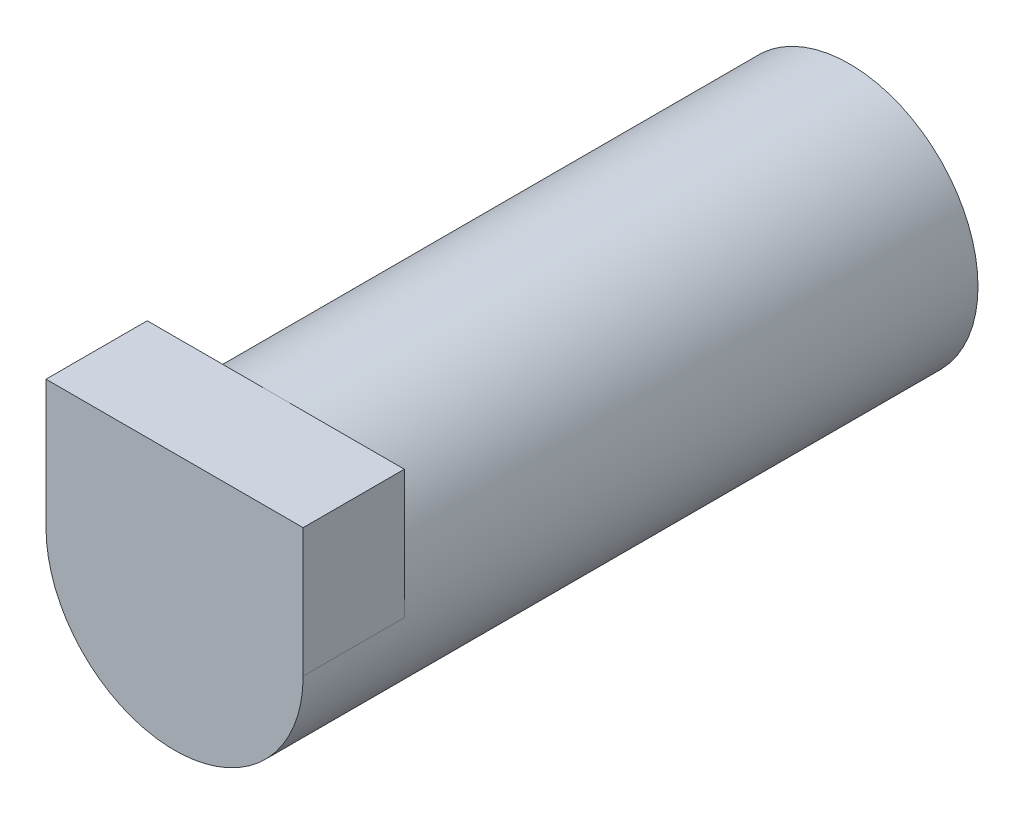
ISO-10303-21;
HEADER;
FILE_DESCRIPTION(('STEP AP214'),'2;1');
FILE_NAME('part.step','',(''),(''),'','','');
FILE_SCHEMA(('AUTOMOTIVE_DESIGN { 1 0 10303 214 1 1 1 1 }'));
ENDSEC;
DATA;
#1=APPLICATION_CONTEXT('core data for automotive mechanical design processes');
#2=APPLICATION_PROTOCOL_DEFINITION('international standard','automotive_design',2000,#1);
#3=PRODUCT_CONTEXT('',#1,'mechanical');
#4=PRODUCT('Part','Part','',(#3));
#5=PRODUCT_RELATED_PRODUCT_CATEGORY('part','',(#4));
#6=PRODUCT_DEFINITION_FORMATION('','',#4);
#7=PRODUCT_DEFINITION_CONTEXT('part definition',#1,'design');
#8=PRODUCT_DEFINITION('design','',#6,#7);
#9=PRODUCT_DEFINITION_SHAPE('','',#8);
#10=(LENGTH_UNIT() NAMED_UNIT(*) SI_UNIT(.MILLI.,.METRE.));
#11=(NAMED_UNIT(*) PLANE_ANGLE_UNIT() SI_UNIT($,.RADIAN.));
#12=(NAMED_UNIT(*) SI_UNIT($,.STERADIAN.) SOLID_ANGLE_UNIT());
#13=UNCERTAINTY_MEASURE_WITH_UNIT(LENGTH_MEASURE(1.E-05),#10,'distance_accuracy_value','');
#14=(GEOMETRIC_REPRESENTATION_CONTEXT(3) GLOBAL_UNCERTAINTY_ASSIGNED_CONTEXT((#13)) GLOBAL_UNIT_ASSIGNED_CONTEXT((#10,
#11,#12)) REPRESENTATION_CONTEXT('',''));
#15=CARTESIAN_POINT('',(0.,0.,0.));
#16=DIRECTION('',(0.,0.,1.));
#17=DIRECTION('',(1.,0.,0.));
#18=AXIS2_PLACEMENT_3D('',#15,#16,#17);
#19=CARTESIAN_POINT('',(0.,0.,100.));
#20=DIRECTION('',(0.,0.,-1.));
#21=DIRECTION('',(-1.,0.,0.));
#22=AXIS2_PLACEMENT_3D('',#19,#20,#21);
#23=CYLINDRICAL_SURFACE('',#22,19.05);
#24=CARTESIAN_POINT('',(0.,0.,100.));
#25=DIRECTION('',(0.,0.,1.));
#26=DIRECTION('',(1.,0.,0.));
#27=AXIS2_PLACEMENT_3D('',#24,#25,#26);
#28=CIRCLE('',#27,19.05);
#29=CARTESIAN_POINT('',(-19.05,0.,100.));
#30=VERTEX_POINT('',#29);
#31=CARTESIAN_POINT('',(19.05,0.,100.));
#32=VERTEX_POINT('',#31);
#33=EDGE_CURVE('E12',#30,#32,#28,.T.);
#34=ORIENTED_EDGE('',*,*,#33,.F.);
#35=DIRECTION('',(0.,0.,1.));
#36=VECTOR('',#35,1.);
#37=CARTESIAN_POINT('',(-19.05,0.,85.));
#38=LINE('',#37,#36);
#39=CARTESIAN_POINT('',(-19.05,0.,85.));
#40=VERTEX_POINT('',#39);
#41=EDGE_CURVE('E119',#40,#30,#38,.T.);
#42=ORIENTED_EDGE('',*,*,#41,.F.);
#43=CARTESIAN_POINT('',(0.,0.,85.));
#44=DIRECTION('',(0.,0.,1.));
#45=DIRECTION('',(1.,0.,0.));
#46=AXIS2_PLACEMENT_3D('',#43,#44,#45);
#47=CIRCLE('',#46,19.05);
#48=CARTESIAN_POINT('',(0.,19.05,85.));
#49=VERTEX_POINT('',#48);
#50=EDGE_CURVE('E88',#49,#40,#47,.T.);
#51=ORIENTED_EDGE('',*,*,#50,.F.);
#52=CARTESIAN_POINT('',(0.,0.,85.));
#53=DIRECTION('',(0.,0.,1.));
#54=DIRECTION('',(1.,0.,0.));
#55=AXIS2_PLACEMENT_3D('',#52,#53,#54);
#56=CIRCLE('',#55,19.05);
#57=CARTESIAN_POINT('',(19.05,0.,85.));
#58=VERTEX_POINT('',#57);
#59=EDGE_CURVE('E107',#58,#49,#56,.T.);
#60=ORIENTED_EDGE('',*,*,#59,.F.);
#61=DIRECTION('',(0.,0.,1.));
#62=VECTOR('',#61,1.);
#63=CARTESIAN_POINT('',(19.05,0.,85.));
#64=LINE('',#63,#62);
#65=EDGE_CURVE('E131',#58,#32,#64,.T.);
#66=ORIENTED_EDGE('',*,*,#65,.T.);
#67=EDGE_LOOP('',(#34,#42,#51,#60,#66));
#68=FACE_BOUND('',#67,.T.);
#69=CARTESIAN_POINT('',(0.,0.,0.));
#70=DIRECTION('',(0.,0.,1.));
#71=DIRECTION('',(1.,0.,0.));
#72=AXIS2_PLACEMENT_3D('',#69,#70,#71);
#73=CIRCLE('',#72,19.05);
#74=CARTESIAN_POINT('',(19.05,0.,0.));
#75=VERTEX_POINT('',#74);
#76=EDGE_CURVE('E56',#75,#75,#73,.T.);
#77=ORIENTED_EDGE('',*,*,#76,.T.);
#78=EDGE_LOOP('',(#77));
#79=FACE_BOUND('',#78,.T.);
#80=ADVANCED_FACE('F53',(#68,#79),#23,.T.);
#81=CARTESIAN_POINT('',(0.,0.,100.));
#82=DIRECTION('',(0.,0.,1.));
#83=DIRECTION('',(1.,0.,0.));
#84=AXIS2_PLACEMENT_3D('',#81,#82,#83);
#85=PLANE('',#84);
#86=DIRECTION('',(1.,0.,0.));
#87=VECTOR('',#86,1.);
#88=CARTESIAN_POINT('',(0.,19.05,100.));
#89=LINE('',#88,#87);
#90=CARTESIAN_POINT('',(-19.05,19.05,100.));
#91=VERTEX_POINT('',#90);
#92=CARTESIAN_POINT('',(19.05,19.05,100.));
#93=VERTEX_POINT('',#92);
#94=EDGE_CURVE('E100',#91,#93,#89,.T.);
#95=ORIENTED_EDGE('',*,*,#94,.F.);
#96=DIRECTION('',(0.,1.,0.));
#97=VECTOR('',#96,1.);
#98=CARTESIAN_POINT('',(-19.05,0.,100.));
#99=LINE('',#98,#97);
#100=EDGE_CURVE('E104',#30,#91,#99,.T.);
#101=ORIENTED_EDGE('',*,*,#100,.F.);
#102=ORIENTED_EDGE('',*,*,#33,.T.);
#103=DIRECTION('',(0.,1.,0.));
#104=VECTOR('',#103,1.);
#105=CARTESIAN_POINT('',(19.05,0.,100.));
#106=LINE('',#105,#104);
#107=EDGE_CURVE('E105',#32,#93,#106,.T.);
#108=ORIENTED_EDGE('',*,*,#107,.T.);
#109=EDGE_LOOP('',(#95,#101,#102,#108));
#110=FACE_BOUND('',#109,.T.);
#111=ADVANCED_FACE('F102',(#110),#85,.T.);
#112=CARTESIAN_POINT('',(0.,0.,0.));
#113=DIRECTION('',(0.,0.,1.));
#114=DIRECTION('',(1.,0.,0.));
#115=AXIS2_PLACEMENT_3D('',#112,#113,#114);
#116=PLANE('',#115);
#117=ORIENTED_EDGE('',*,*,#76,.F.);
#118=EDGE_LOOP('',(#117));
#119=FACE_BOUND('',#118,.T.);
#120=ADVANCED_FACE('F157',(#119),#116,.F.);
#121=CARTESIAN_POINT('',(0.,19.05,85.));
#122=DIRECTION('',(0.,-1.,0.));
#123=DIRECTION('',(1.,0.,0.));
#124=AXIS2_PLACEMENT_3D('',#121,#122,#123);
#125=PLANE('',#124);
#126=ORIENTED_EDGE('',*,*,#94,.T.);
#127=DIRECTION('',(0.,0.,1.));
#128=VECTOR('',#127,1.);
#129=CARTESIAN_POINT('',(19.05,19.05,85.));
#130=LINE('',#129,#128);
#131=CARTESIAN_POINT('',(19.05,19.05,85.));
#132=VERTEX_POINT('',#131);
#133=EDGE_CURVE('E133',#132,#93,#130,.T.);
#134=ORIENTED_EDGE('',*,*,#133,.F.);
#135=DIRECTION('',(1.,0.,0.));
#136=VECTOR('',#135,1.);
#137=CARTESIAN_POINT('',(0.,19.05,85.));
#138=LINE('',#137,#136);
#139=EDGE_CURVE('E69',#49,#132,#138,.T.);
#140=ORIENTED_EDGE('',*,*,#139,.F.);
#141=DIRECTION('',(-1.,0.,0.));
#142=VECTOR('',#141,1.);
#143=CARTESIAN_POINT('',(0.,19.05,85.));
#144=LINE('',#143,#142);
#145=CARTESIAN_POINT('',(-19.05,19.05,85.));
#146=VERTEX_POINT('',#145);
#147=EDGE_CURVE('E113',#49,#146,#144,.T.);
#148=ORIENTED_EDGE('',*,*,#147,.T.);
#149=DIRECTION('',(0.,0.,1.));
#150=VECTOR('',#149,1.);
#151=CARTESIAN_POINT('',(-19.05,19.05,85.));
#152=LINE('',#151,#150);
#153=EDGE_CURVE('E111',#146,#91,#152,.T.);
#154=ORIENTED_EDGE('',*,*,#153,.T.);
#155=EDGE_LOOP('',(#126,#134,#140,#148,#154));
#156=FACE_BOUND('',#155,.T.);
#157=ADVANCED_FACE('F112',(#156),#125,.F.);
#158=CARTESIAN_POINT('',(19.05,0.,85.));
#159=DIRECTION('',(1.,0.,0.));
#160=DIRECTION('',(0.,0.,-1.));
#161=AXIS2_PLACEMENT_3D('',#158,#159,#160);
#162=PLANE('',#161);
#163=ORIENTED_EDGE('',*,*,#107,.F.);
#164=ORIENTED_EDGE('',*,*,#65,.F.);
#165=DIRECTION('',(0.,1.,0.));
#166=VECTOR('',#165,1.);
#167=CARTESIAN_POINT('',(19.05,0.,85.));
#168=LINE('',#167,#166);
#169=EDGE_CURVE('E127',#58,#132,#168,.T.);
#170=ORIENTED_EDGE('',*,*,#169,.T.);
#171=ORIENTED_EDGE('',*,*,#133,.T.);
#172=EDGE_LOOP('',(#163,#164,#170,#171));
#173=FACE_BOUND('',#172,.T.);
#174=ADVANCED_FACE('F140',(#173),#162,.T.);
#175=CARTESIAN_POINT('',(0.,0.,85.));
#176=DIRECTION('',(0.,0.,1.));
#177=DIRECTION('',(1.,0.,0.));
#178=AXIS2_PLACEMENT_3D('',#175,#176,#177);
#179=PLANE('',#178);
#180=ORIENTED_EDGE('',*,*,#59,.T.);
#181=ORIENTED_EDGE('',*,*,#139,.T.);
#182=ORIENTED_EDGE('',*,*,#169,.F.);
#183=EDGE_LOOP('',(#180,#181,#182));
#184=FACE_BOUND('',#183,.T.);
#185=ADVANCED_FACE('F141',(#184),#179,.F.);
#186=CARTESIAN_POINT('',(-19.05,0.,85.));
#187=DIRECTION('',(1.,0.,0.));
#188=DIRECTION('',(0.,0.,-1.));
#189=AXIS2_PLACEMENT_3D('',#186,#187,#188);
#190=PLANE('',#189);
#191=ORIENTED_EDGE('',*,*,#100,.T.);
#192=ORIENTED_EDGE('',*,*,#153,.F.);
#193=DIRECTION('',(0.,1.,0.));
#194=VECTOR('',#193,1.);
#195=CARTESIAN_POINT('',(-19.05,0.,85.));
#196=LINE('',#195,#194);
#197=EDGE_CURVE('E115',#40,#146,#196,.T.);
#198=ORIENTED_EDGE('',*,*,#197,.F.);
#199=ORIENTED_EDGE('',*,*,#41,.T.);
#200=EDGE_LOOP('',(#191,#192,#198,#199));
#201=FACE_BOUND('',#200,.T.);
#202=ADVANCED_FACE('F117',(#201),#190,.F.);
#203=CARTESIAN_POINT('',(0.,0.,85.));
#204=DIRECTION('',(0.,0.,1.));
#205=DIRECTION('',(1.,0.,0.));
#206=AXIS2_PLACEMENT_3D('',#203,#204,#205);
#207=PLANE('',#206);
#208=ORIENTED_EDGE('',*,*,#197,.T.);
#209=ORIENTED_EDGE('',*,*,#147,.F.);
#210=ORIENTED_EDGE('',*,*,#50,.T.);
#211=EDGE_LOOP('',(#208,#209,#210));
#212=FACE_BOUND('',#211,.T.);
#213=ADVANCED_FACE('F148',(#212),#207,.F.);
#214=CLOSED_SHELL('',(#80,#111,#120,#157,#174,#185,#202,#213));
#215=MANIFOLD_SOLID_BREP('B2',#214);
#216=ADVANCED_BREP_SHAPE_REPRESENTATION('',(#18,#215),#14);
#217=SHAPE_DEFINITION_REPRESENTATION(#9,#216);
ENDSEC;
END-ISO-10303-21;
